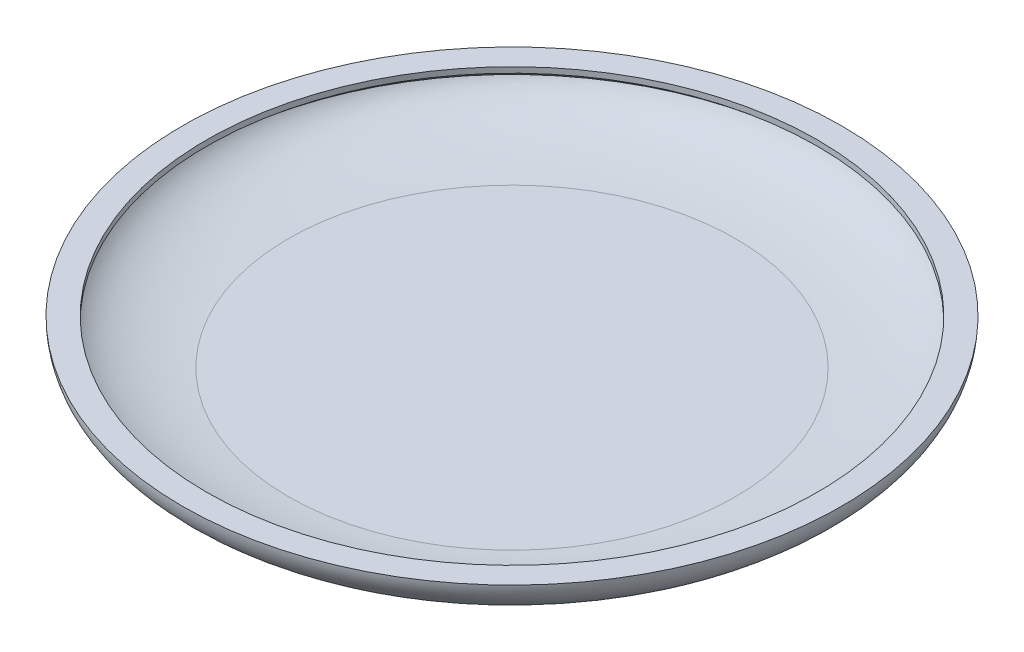
ISO-10303-21;
HEADER;
FILE_DESCRIPTION(('STEP AP214'),'2;1');
FILE_NAME('part.step','',(''),(''),'','','');
FILE_SCHEMA(('AUTOMOTIVE_DESIGN { 1 0 10303 214 1 1 1 1 }'));
ENDSEC;
DATA;
#1=APPLICATION_CONTEXT('core data for automotive mechanical design processes');
#2=APPLICATION_PROTOCOL_DEFINITION('international standard','automotive_design',2000,#1);
#3=PRODUCT_CONTEXT('',#1,'mechanical');
#4=PRODUCT('Part','Part','',(#3));
#5=PRODUCT_RELATED_PRODUCT_CATEGORY('part','',(#4));
#6=PRODUCT_DEFINITION_FORMATION('','',#4);
#7=PRODUCT_DEFINITION_CONTEXT('part definition',#1,'design');
#8=PRODUCT_DEFINITION('design','',#6,#7);
#9=PRODUCT_DEFINITION_SHAPE('','',#8);
#10=(LENGTH_UNIT() NAMED_UNIT(*) SI_UNIT(.MILLI.,.METRE.));
#11=(NAMED_UNIT(*) PLANE_ANGLE_UNIT() SI_UNIT($,.RADIAN.));
#12=(NAMED_UNIT(*) SI_UNIT($,.STERADIAN.) SOLID_ANGLE_UNIT());
#13=UNCERTAINTY_MEASURE_WITH_UNIT(LENGTH_MEASURE(1.E-05),#10,'distance_accuracy_value','');
#14=(GEOMETRIC_REPRESENTATION_CONTEXT(3) GLOBAL_UNCERTAINTY_ASSIGNED_CONTEXT((#13)) GLOBAL_UNIT_ASSIGNED_CONTEXT((#10,
#11,#12)) REPRESENTATION_CONTEXT('',''));
#15=CARTESIAN_POINT('',(0.,0.,0.));
#16=DIRECTION('',(0.,0.,1.));
#17=DIRECTION('',(1.,0.,0.));
#18=AXIS2_PLACEMENT_3D('',#15,#16,#17);
#19=CARTESIAN_POINT('',(-60.,1.99999999999999,0.));
#20=DIRECTION('',(0.,1.,0.));
#21=DIRECTION('',(0.,0.,1.));
#22=AXIS2_PLACEMENT_3D('',#19,#20,#21);
#23=PLANE('',#22);
#24=CARTESIAN_POINT('',(0.,1.99999999999999,0.));
#25=DIRECTION('',(0.,1.,0.));
#26=DIRECTION('',(0.,0.,1.));
#27=AXIS2_PLACEMENT_3D('',#24,#25,#26);
#28=CIRCLE('',#27,60.);
#29=CARTESIAN_POINT('',(0.,1.99999999999999,60.));
#30=VERTEX_POINT('',#29);
#31=EDGE_CURVE('E10',#30,#30,#28,.T.);
#32=ORIENTED_EDGE('',*,*,#31,.T.);
#33=EDGE_LOOP('',(#32));
#34=FACE_BOUND('',#33,.T.);
#35=ADVANCED_FACE('F31',(#34),#23,.T.);
#36=CARTESIAN_POINT('',(-60.,1.99999999999999,0.));
#37=CARTESIAN_POINT('',(-80.4731709384476,3.42035668032313,0.));
#38=CARTESIAN_POINT('',(-84.2713693091235,10.5516679068983,0.));
#39=B_SPLINE_CURVE_WITH_KNOTS('',2,(#36,#37,#38),.UNSPECIFIED.,.F.,.F.,(3,3),(0.,1.),.UNSPECIFIED.);
#40=CARTESIAN_POINT('',(0.,26.6430878334909,0.));
#41=DIRECTION('',(0.,1.,0.));
#42=AXIS1_PLACEMENT('',#40,#41);
#43=SURFACE_OF_REVOLUTION('',#39,#42);
#44=CARTESIAN_POINT('',(0.,10.5516679068983,0.));
#45=DIRECTION('',(0.,1.,0.));
#46=DIRECTION('',(0.,0.,1.));
#47=AXIS2_PLACEMENT_3D('',#44,#45,#46);
#48=CIRCLE('',#47,84.2713693091235);
#49=CARTESIAN_POINT('',(0.,10.5516679068983,84.2713693091235));
#50=VERTEX_POINT('',#49);
#51=EDGE_CURVE('E37',#50,#50,#48,.T.);
#52=ORIENTED_EDGE('',*,*,#51,.T.);
#53=EDGE_LOOP('',(#52));
#54=FACE_BOUND('',#53,.T.);
#55=ORIENTED_EDGE('',*,*,#31,.F.);
#56=EDGE_LOOP('',(#55));
#57=FACE_BOUND('',#56,.T.);
#58=ADVANCED_FACE('F83',(#54,#57),#43,.F.);
#59=CARTESIAN_POINT('',(0.,10.5516679068983,0.));
#60=DIRECTION('',(0.,-1.,0.));
#61=DIRECTION('',(0.,0.,-1.));
#62=AXIS2_PLACEMENT_3D('',#59,#60,#61);
#63=CONICAL_SURFACE('',#62,84.2713693091235,0.87254532962398);
#64=CARTESIAN_POINT('',(0.,12.5,0.));
#65=DIRECTION('',(0.,1.,0.));
#66=DIRECTION('',(0.,0.,1.));
#67=AXIS2_PLACEMENT_3D('',#64,#65,#66);
#68=CIRCLE('',#67,81.95);
#69=CARTESIAN_POINT('',(0.,12.5,81.95));
#70=VERTEX_POINT('',#69);
#71=EDGE_CURVE('E41',#70,#70,#68,.T.);
#72=ORIENTED_EDGE('',*,*,#71,.T.);
#73=EDGE_LOOP('',(#72));
#74=FACE_BOUND('',#73,.T.);
#75=ORIENTED_EDGE('',*,*,#51,.F.);
#76=EDGE_LOOP('',(#75));
#77=FACE_BOUND('',#76,.T.);
#78=ADVANCED_FACE('F80',(#74,#77),#63,.F.);
#79=CARTESIAN_POINT('',(0.,26.6430878334909,0.));
#80=DIRECTION('',(0.,1.,0.));
#81=DIRECTION('',(0.,0.,1.));
#82=AXIS2_PLACEMENT_3D('',#79,#80,#81);
#83=CYLINDRICAL_SURFACE('',#82,81.95);
#84=CARTESIAN_POINT('',(0.,14.,0.));
#85=DIRECTION('',(0.,1.,0.));
#86=DIRECTION('',(0.,0.,1.));
#87=AXIS2_PLACEMENT_3D('',#84,#85,#86);
#88=CIRCLE('',#87,81.95);
#89=CARTESIAN_POINT('',(0.,14.,81.95));
#90=VERTEX_POINT('',#89);
#91=EDGE_CURVE('E45',#90,#90,#88,.T.);
#92=ORIENTED_EDGE('',*,*,#91,.T.);
#93=EDGE_LOOP('',(#92));
#94=FACE_BOUND('',#93,.T.);
#95=ORIENTED_EDGE('',*,*,#71,.F.);
#96=EDGE_LOOP('',(#95));
#97=FACE_BOUND('',#96,.T.);
#98=ADVANCED_FACE('F76',(#94,#97),#83,.F.);
#99=CARTESIAN_POINT('',(-88.45,14.,0.));
#100=DIRECTION('',(0.,1.,0.));
#101=DIRECTION('',(0.,0.,1.));
#102=AXIS2_PLACEMENT_3D('',#99,#100,#101);
#103=PLANE('',#102);
#104=CARTESIAN_POINT('',(0.,14.,0.));
#105=DIRECTION('',(0.,1.,0.));
#106=DIRECTION('',(0.,0.,1.));
#107=AXIS2_PLACEMENT_3D('',#104,#105,#106);
#108=CIRCLE('',#107,88.45);
#109=CARTESIAN_POINT('',(0.,14.,88.45));
#110=VERTEX_POINT('',#109);
#111=EDGE_CURVE('E50',#110,#110,#108,.T.);
#112=ORIENTED_EDGE('',*,*,#111,.T.);
#113=EDGE_LOOP('',(#112));
#114=FACE_BOUND('',#113,.T.);
#115=ORIENTED_EDGE('',*,*,#91,.F.);
#116=EDGE_LOOP('',(#115));
#117=FACE_BOUND('',#116,.T.);
#118=ADVANCED_FACE('F72',(#114,#117),#103,.T.);
#119=CARTESIAN_POINT('',(-88.45,14.,0.));
#120=CARTESIAN_POINT('',(-88.0008538135021,2.64508799352332,0.));
#121=CARTESIAN_POINT('',(-68.314971093743,-0.00524791991056514,0.));
#122=CARTESIAN_POINT('',(-59.8117080170937,0.,0.));
#123=B_SPLINE_CURVE_WITH_KNOTS('',3,(#119,#120,#121,#122),.UNSPECIFIED.,.F.,.F.,(4,4),(0.,1.),.UNSPECIFIED.);
#124=CARTESIAN_POINT('',(0.,26.6430878334909,0.));
#125=DIRECTION('',(0.,1.,0.));
#126=AXIS1_PLACEMENT('',#124,#125);
#127=SURFACE_OF_REVOLUTION('',#123,#126);
#128=CARTESIAN_POINT('',(0.,0.,0.));
#129=DIRECTION('',(0.,1.,0.));
#130=DIRECTION('',(0.,0.,1.));
#131=AXIS2_PLACEMENT_3D('',#128,#129,#130);
#132=CIRCLE('',#131,59.8117080170937);
#133=CARTESIAN_POINT('',(0.,0.,59.8117080170937));
#134=VERTEX_POINT('',#133);
#135=EDGE_CURVE('E53',#134,#134,#132,.T.);
#136=ORIENTED_EDGE('',*,*,#135,.T.);
#137=EDGE_LOOP('',(#136));
#138=FACE_BOUND('',#137,.T.);
#139=ORIENTED_EDGE('',*,*,#111,.F.);
#140=EDGE_LOOP('',(#139));
#141=FACE_BOUND('',#140,.T.);
#142=ADVANCED_FACE('F67',(#138,#141),#127,.F.);
#143=CARTESIAN_POINT('',(0.,0.,0.));
#144=DIRECTION('',(0.,-1.,0.));
#145=DIRECTION('',(0.,0.,-1.));
#146=AXIS2_PLACEMENT_3D('',#143,#144,#145);
#147=PLANE('',#146);
#148=ORIENTED_EDGE('',*,*,#135,.F.);
#149=EDGE_LOOP('',(#148));
#150=FACE_BOUND('',#149,.T.);
#151=ADVANCED_FACE('F71',(#150),#147,.T.);
#152=CLOSED_SHELL('',(#35,#58,#78,#98,#118,#142,#151));
#153=MANIFOLD_SOLID_BREP('B2',#152);
#154=ADVANCED_BREP_SHAPE_REPRESENTATION('',(#18,#153),#14);
#155=SHAPE_DEFINITION_REPRESENTATION(#9,#154);
ENDSEC;
END-ISO-10303-21;
